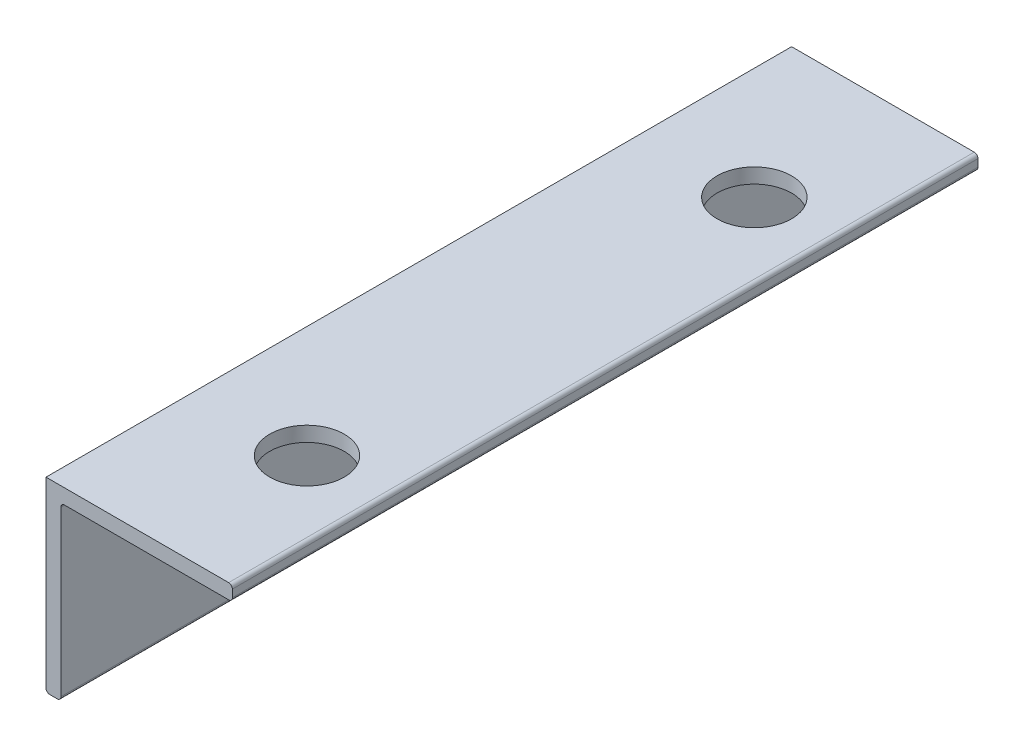
ISO-10303-21;
HEADER;
FILE_DESCRIPTION(('STEP AP214'),'2;1');
FILE_NAME('part.step','',(''),(''),'','','');
FILE_SCHEMA(('AUTOMOTIVE_DESIGN { 1 0 10303 214 1 1 1 1 }'));
ENDSEC;
DATA;
#1=APPLICATION_CONTEXT('core data for automotive mechanical design processes');
#2=APPLICATION_PROTOCOL_DEFINITION('international standard','automotive_design',2000,#1);
#3=PRODUCT_CONTEXT('',#1,'mechanical');
#4=PRODUCT('Part','Part','',(#3));
#5=PRODUCT_RELATED_PRODUCT_CATEGORY('part','',(#4));
#6=PRODUCT_DEFINITION_FORMATION('','',#4);
#7=PRODUCT_DEFINITION_CONTEXT('part definition',#1,'design');
#8=PRODUCT_DEFINITION('design','',#6,#7);
#9=PRODUCT_DEFINITION_SHAPE('','',#8);
#10=(LENGTH_UNIT() NAMED_UNIT(*) SI_UNIT(.MILLI.,.METRE.));
#11=(NAMED_UNIT(*) PLANE_ANGLE_UNIT() SI_UNIT($,.RADIAN.));
#12=(NAMED_UNIT(*) SI_UNIT($,.STERADIAN.) SOLID_ANGLE_UNIT());
#13=UNCERTAINTY_MEASURE_WITH_UNIT(LENGTH_MEASURE(1.E-05),#10,'distance_accuracy_value','');
#14=(GEOMETRIC_REPRESENTATION_CONTEXT(3) GLOBAL_UNCERTAINTY_ASSIGNED_CONTEXT((#13)) GLOBAL_UNIT_ASSIGNED_CONTEXT((#10,
#11,#12)) REPRESENTATION_CONTEXT('',''));
#15=CARTESIAN_POINT('',(0.,0.,0.));
#16=DIRECTION('',(0.,0.,1.));
#17=DIRECTION('',(1.,0.,0.));
#18=AXIS2_PLACEMENT_3D('',#15,#16,#17);
#19=CARTESIAN_POINT('',(-15.,15.,100.));
#20=DIRECTION('',(0.,-1.,0.));
#21=DIRECTION('',(0.,0.,-1.));
#22=AXIS2_PLACEMENT_3D('',#19,#20,#21);
#23=PLANE('',#22);
#24=CARTESIAN_POINT('',(0.,15.,20.));
#25=DIRECTION('',(0.,1.,0.));
#26=DIRECTION('',(0.,0.,1.));
#27=AXIS2_PLACEMENT_3D('',#24,#25,#26);
#28=CIRCLE('',#27,5.);
#29=CARTESIAN_POINT('',(0.,15.,25.));
#30=VERTEX_POINT('',#29);
#31=EDGE_CURVE('E250',#30,#30,#28,.T.);
#32=ORIENTED_EDGE('',*,*,#31,.F.);
#33=EDGE_LOOP('',(#32));
#34=FACE_BOUND('',#33,.T.);
#35=CARTESIAN_POINT('',(0.,15.,80.));
#36=DIRECTION('',(0.,1.,0.));
#37=DIRECTION('',(0.,0.,1.));
#38=AXIS2_PLACEMENT_3D('',#35,#36,#37);
#39=CIRCLE('',#38,5.);
#40=CARTESIAN_POINT('',(0.,15.,85.));
#41=VERTEX_POINT('',#40);
#42=EDGE_CURVE('E253',#41,#41,#39,.T.);
#43=ORIENTED_EDGE('',*,*,#42,.F.);
#44=EDGE_LOOP('',(#43));
#45=FACE_BOUND('',#44,.T.);
#46=DIRECTION('',(-1.,0.,0.));
#47=VECTOR('',#46,1.);
#48=CARTESIAN_POINT('',(-15.,15.,0.));
#49=LINE('',#48,#47);
#50=CARTESIAN_POINT('',(9.5,15.,0.));
#51=VERTEX_POINT('',#50);
#52=CARTESIAN_POINT('',(-15.,15.,0.));
#53=VERTEX_POINT('',#52);
#54=EDGE_CURVE('E149',#51,#53,#49,.T.);
#55=ORIENTED_EDGE('',*,*,#54,.T.);
#56=DIRECTION('',(0.,0.,-1.));
#57=VECTOR('',#56,1.);
#58=CARTESIAN_POINT('',(-15.,15.,100.));
#59=LINE('',#58,#57);
#60=CARTESIAN_POINT('',(-15.,15.,100.));
#61=VERTEX_POINT('',#60);
#62=EDGE_CURVE('E11',#61,#53,#59,.T.);
#63=ORIENTED_EDGE('',*,*,#62,.F.);
#64=DIRECTION('',(-1.,0.,0.));
#65=VECTOR('',#64,1.);
#66=CARTESIAN_POINT('',(-15.,15.,100.));
#67=LINE('',#66,#65);
#68=CARTESIAN_POINT('',(9.5,15.,100.));
#69=VERTEX_POINT('',#68);
#70=EDGE_CURVE('E170',#69,#61,#67,.T.);
#71=ORIENTED_EDGE('',*,*,#70,.F.);
#72=DIRECTION('',(0.,0.,-1.));
#73=VECTOR('',#72,1.);
#74=CARTESIAN_POINT('',(9.5,15.,100.));
#75=LINE('',#74,#73);
#76=EDGE_CURVE('E145',#69,#51,#75,.T.);
#77=ORIENTED_EDGE('',*,*,#76,.T.);
#78=EDGE_LOOP('',(#55,#63,#71,#77));
#79=FACE_BOUND('',#78,.T.);
#80=ADVANCED_FACE('F35',(#34,#45,#79),#23,.F.);
#81=CARTESIAN_POINT('',(-15.,-9.5,100.));
#82=DIRECTION('',(1.,0.,0.));
#83=DIRECTION('',(0.,0.,-1.));
#84=AXIS2_PLACEMENT_3D('',#81,#82,#83);
#85=PLANE('',#84);
#86=DIRECTION('',(0.,-1.,0.));
#87=VECTOR('',#86,1.);
#88=CARTESIAN_POINT('',(-15.,-9.5,0.));
#89=LINE('',#88,#87);
#90=CARTESIAN_POINT('',(-15.,-9.5,0.));
#91=VERTEX_POINT('',#90);
#92=EDGE_CURVE('E152',#53,#91,#89,.T.);
#93=ORIENTED_EDGE('',*,*,#92,.T.);
#94=DIRECTION('',(0.,0.,-1.));
#95=VECTOR('',#94,1.);
#96=CARTESIAN_POINT('',(-15.,-9.5,100.));
#97=LINE('',#96,#95);
#98=CARTESIAN_POINT('',(-15.,-9.5,100.));
#99=VERTEX_POINT('',#98);
#100=EDGE_CURVE('E43',#99,#91,#97,.T.);
#101=ORIENTED_EDGE('',*,*,#100,.F.);
#102=DIRECTION('',(0.,-1.,0.));
#103=VECTOR('',#102,1.);
#104=CARTESIAN_POINT('',(-15.,-9.5,100.));
#105=LINE('',#104,#103);
#106=EDGE_CURVE('E103',#61,#99,#105,.T.);
#107=ORIENTED_EDGE('',*,*,#106,.F.);
#108=ORIENTED_EDGE('',*,*,#62,.T.);
#109=EDGE_LOOP('',(#93,#101,#107,#108));
#110=FACE_BOUND('',#109,.T.);
#111=ADVANCED_FACE('F242',(#110),#85,.F.);
#112=CARTESIAN_POINT('',(-14.5,-9.5,100.));
#113=DIRECTION('',(0.,0.,-1.));
#114=DIRECTION('',(-1.,0.,0.));
#115=AXIS2_PLACEMENT_3D('',#112,#113,#114);
#116=CYLINDRICAL_SURFACE('',#115,0.5);
#117=CARTESIAN_POINT('',(-14.5,-9.5,0.));
#118=DIRECTION('',(0.,0.,1.));
#119=DIRECTION('',(-1.,0.,0.));
#120=AXIS2_PLACEMENT_3D('',#117,#118,#119);
#121=CIRCLE('',#120,0.5);
#122=CARTESIAN_POINT('',(-14.5,-10.,0.));
#123=VERTEX_POINT('',#122);
#124=EDGE_CURVE('E155',#91,#123,#121,.T.);
#125=ORIENTED_EDGE('',*,*,#124,.T.);
#126=DIRECTION('',(0.,0.,-1.));
#127=VECTOR('',#126,1.);
#128=CARTESIAN_POINT('',(-14.5,-10.,100.));
#129=LINE('',#128,#127);
#130=CARTESIAN_POINT('',(-14.5,-10.,100.));
#131=VERTEX_POINT('',#130);
#132=EDGE_CURVE('E186',#131,#123,#129,.T.);
#133=ORIENTED_EDGE('',*,*,#132,.F.);
#134=CARTESIAN_POINT('',(-14.5,-9.5,100.));
#135=DIRECTION('',(0.,0.,1.));
#136=DIRECTION('',(-1.,0.,0.));
#137=AXIS2_PLACEMENT_3D('',#134,#135,#136);
#138=CIRCLE('',#137,0.5);
#139=EDGE_CURVE('E194',#99,#131,#138,.T.);
#140=ORIENTED_EDGE('',*,*,#139,.F.);
#141=ORIENTED_EDGE('',*,*,#100,.T.);
#142=EDGE_LOOP('',(#125,#133,#140,#141));
#143=FACE_BOUND('',#142,.T.);
#144=ADVANCED_FACE('F192',(#143),#116,.T.);
#145=CARTESIAN_POINT('',(-14.5,-10.,100.));
#146=DIRECTION('',(0.,1.,0.));
#147=DIRECTION('',(0.,0.,1.));
#148=AXIS2_PLACEMENT_3D('',#145,#146,#147);
#149=PLANE('',#148);
#150=DIRECTION('',(1.,0.,0.));
#151=VECTOR('',#150,1.);
#152=CARTESIAN_POINT('',(-14.5,-10.,0.));
#153=LINE('',#152,#151);
#154=CARTESIAN_POINT('',(-13.5,-10.,0.));
#155=VERTEX_POINT('',#154);
#156=EDGE_CURVE('E157',#123,#155,#153,.T.);
#157=ORIENTED_EDGE('',*,*,#156,.T.);
#158=DIRECTION('',(0.,0.,-1.));
#159=VECTOR('',#158,1.);
#160=CARTESIAN_POINT('',(-13.5,-10.,100.));
#161=LINE('',#160,#159);
#162=CARTESIAN_POINT('',(-13.5,-10.,100.));
#163=VERTEX_POINT('',#162);
#164=EDGE_CURVE('E183',#163,#155,#161,.T.);
#165=ORIENTED_EDGE('',*,*,#164,.F.);
#166=DIRECTION('',(1.,0.,0.));
#167=VECTOR('',#166,1.);
#168=CARTESIAN_POINT('',(-14.5,-10.,100.));
#169=LINE('',#168,#167);
#170=EDGE_CURVE('E212',#131,#163,#169,.T.);
#171=ORIENTED_EDGE('',*,*,#170,.F.);
#172=ORIENTED_EDGE('',*,*,#132,.T.);
#173=EDGE_LOOP('',(#157,#165,#171,#172));
#174=FACE_BOUND('',#173,.T.);
#175=ADVANCED_FACE('F203',(#174),#149,.F.);
#176=CARTESIAN_POINT('',(-13.5,-9.5,100.));
#177=DIRECTION('',(0.,0.,-1.));
#178=DIRECTION('',(-1.,0.,0.));
#179=AXIS2_PLACEMENT_3D('',#176,#177,#178);
#180=CYLINDRICAL_SURFACE('',#179,0.500000000000002);
#181=CARTESIAN_POINT('',(-13.5,-9.5,0.));
#182=DIRECTION('',(0.,0.,1.));
#183=DIRECTION('',(1.,0.,0.));
#184=AXIS2_PLACEMENT_3D('',#181,#182,#183);
#185=CIRCLE('',#184,0.500000000000002);
#186=CARTESIAN_POINT('',(-13.,-9.5,0.));
#187=VERTEX_POINT('',#186);
#188=EDGE_CURVE('E159',#155,#187,#185,.T.);
#189=ORIENTED_EDGE('',*,*,#188,.T.);
#190=DIRECTION('',(0.,0.,-1.));
#191=VECTOR('',#190,1.);
#192=CARTESIAN_POINT('',(-13.,-9.5,100.));
#193=LINE('',#192,#191);
#194=CARTESIAN_POINT('',(-13.,-9.5,100.));
#195=VERTEX_POINT('',#194);
#196=EDGE_CURVE('E180',#195,#187,#193,.T.);
#197=ORIENTED_EDGE('',*,*,#196,.F.);
#198=CARTESIAN_POINT('',(-13.5,-9.5,100.));
#199=DIRECTION('',(0.,0.,1.));
#200=DIRECTION('',(1.,0.,0.));
#201=AXIS2_PLACEMENT_3D('',#198,#199,#200);
#202=CIRCLE('',#201,0.500000000000002);
#203=EDGE_CURVE('E209',#163,#195,#202,.T.);
#204=ORIENTED_EDGE('',*,*,#203,.F.);
#205=ORIENTED_EDGE('',*,*,#164,.T.);
#206=EDGE_LOOP('',(#189,#197,#204,#205));
#207=FACE_BOUND('',#206,.T.);
#208=ADVANCED_FACE('F207',(#207),#180,.T.);
#209=CARTESIAN_POINT('',(-13.,12.5,100.));
#210=DIRECTION('',(-1.,0.,0.));
#211=DIRECTION('',(0.,-1.,0.));
#212=AXIS2_PLACEMENT_3D('',#209,#210,#211);
#213=PLANE('',#212);
#214=DIRECTION('',(0.,1.,0.));
#215=VECTOR('',#214,1.);
#216=CARTESIAN_POINT('',(-13.,12.5,0.));
#217=LINE('',#216,#215);
#218=CARTESIAN_POINT('',(-13.,12.5,0.));
#219=VERTEX_POINT('',#218);
#220=EDGE_CURVE('E161',#187,#219,#217,.T.);
#221=ORIENTED_EDGE('',*,*,#220,.T.);
#222=DIRECTION('',(0.,0.,-1.));
#223=VECTOR('',#222,1.);
#224=CARTESIAN_POINT('',(-13.,12.5,100.));
#225=LINE('',#224,#223);
#226=CARTESIAN_POINT('',(-13.,12.5,100.));
#227=VERTEX_POINT('',#226);
#228=EDGE_CURVE('E177',#227,#219,#225,.T.);
#229=ORIENTED_EDGE('',*,*,#228,.F.);
#230=DIRECTION('',(0.,1.,0.));
#231=VECTOR('',#230,1.);
#232=CARTESIAN_POINT('',(-13.,12.5,100.));
#233=LINE('',#232,#231);
#234=EDGE_CURVE('E211',#195,#227,#233,.T.);
#235=ORIENTED_EDGE('',*,*,#234,.F.);
#236=ORIENTED_EDGE('',*,*,#196,.T.);
#237=EDGE_LOOP('',(#221,#229,#235,#236));
#238=FACE_BOUND('',#237,.T.);
#239=ADVANCED_FACE('F316',(#238),#213,.F.);
#240=CARTESIAN_POINT('',(-12.5,12.5,100.));
#241=DIRECTION('',(0.,0.,-1.));
#242=DIRECTION('',(-1.,0.,0.));
#243=AXIS2_PLACEMENT_3D('',#240,#241,#242);
#244=CYLINDRICAL_SURFACE('',#243,0.5);
#245=CARTESIAN_POINT('',(-12.5,12.5,0.));
#246=DIRECTION('',(0.,0.,-1.));
#247=DIRECTION('',(1.,0.,0.));
#248=AXIS2_PLACEMENT_3D('',#245,#246,#247);
#249=CIRCLE('',#248,0.5);
#250=CARTESIAN_POINT('',(-12.5,13.,0.));
#251=VERTEX_POINT('',#250);
#252=EDGE_CURVE('E163',#219,#251,#249,.T.);
#253=ORIENTED_EDGE('',*,*,#252,.T.);
#254=DIRECTION('',(0.,0.,-1.));
#255=VECTOR('',#254,1.);
#256=CARTESIAN_POINT('',(-12.5,13.,100.));
#257=LINE('',#256,#255);
#258=CARTESIAN_POINT('',(-12.5,13.,100.));
#259=VERTEX_POINT('',#258);
#260=EDGE_CURVE('E174',#259,#251,#257,.T.);
#261=ORIENTED_EDGE('',*,*,#260,.F.);
#262=CARTESIAN_POINT('',(-12.5,12.5,100.));
#263=DIRECTION('',(0.,0.,-1.));
#264=DIRECTION('',(1.,0.,0.));
#265=AXIS2_PLACEMENT_3D('',#262,#263,#264);
#266=CIRCLE('',#265,0.5);
#267=EDGE_CURVE('E214',#227,#259,#266,.T.);
#268=ORIENTED_EDGE('',*,*,#267,.F.);
#269=ORIENTED_EDGE('',*,*,#228,.T.);
#270=EDGE_LOOP('',(#253,#261,#268,#269));
#271=FACE_BOUND('',#270,.T.);
#272=ADVANCED_FACE('F223',(#271),#244,.F.);
#273=CARTESIAN_POINT('',(9.5,13.,100.));
#274=DIRECTION('',(0.,1.,0.));
#275=DIRECTION('',(-1.,0.,0.));
#276=AXIS2_PLACEMENT_3D('',#273,#274,#275);
#277=PLANE('',#276);
#278=CARTESIAN_POINT('',(0.,13.,20.));
#279=DIRECTION('',(0.,1.,0.));
#280=DIRECTION('',(-1.,0.,0.));
#281=AXIS2_PLACEMENT_3D('',#278,#279,#280);
#282=CIRCLE('',#281,5.);
#283=CARTESIAN_POINT('',(-5.,13.,20.));
#284=VERTEX_POINT('',#283);
#285=EDGE_CURVE('E255',#284,#284,#282,.F.);
#286=ORIENTED_EDGE('',*,*,#285,.F.);
#287=EDGE_LOOP('',(#286));
#288=FACE_BOUND('',#287,.T.);
#289=CARTESIAN_POINT('',(0.,13.,80.));
#290=DIRECTION('',(0.,1.,0.));
#291=DIRECTION('',(-1.,0.,0.));
#292=AXIS2_PLACEMENT_3D('',#289,#290,#291);
#293=CIRCLE('',#292,5.);
#294=CARTESIAN_POINT('',(-5.,13.,80.));
#295=VERTEX_POINT('',#294);
#296=EDGE_CURVE('E153',#295,#295,#293,.F.);
#297=ORIENTED_EDGE('',*,*,#296,.F.);
#298=EDGE_LOOP('',(#297));
#299=FACE_BOUND('',#298,.T.);
#300=DIRECTION('',(1.,0.,0.));
#301=VECTOR('',#300,1.);
#302=CARTESIAN_POINT('',(9.5,13.,0.));
#303=LINE('',#302,#301);
#304=CARTESIAN_POINT('',(9.5,13.,0.));
#305=VERTEX_POINT('',#304);
#306=EDGE_CURVE('E165',#251,#305,#303,.T.);
#307=ORIENTED_EDGE('',*,*,#306,.T.);
#308=DIRECTION('',(0.,0.,-1.));
#309=VECTOR('',#308,1.);
#310=CARTESIAN_POINT('',(9.5,13.,100.));
#311=LINE('',#310,#309);
#312=CARTESIAN_POINT('',(9.5,13.,100.));
#313=VERTEX_POINT('',#312);
#314=EDGE_CURVE('E140',#313,#305,#311,.T.);
#315=ORIENTED_EDGE('',*,*,#314,.F.);
#316=DIRECTION('',(1.,0.,0.));
#317=VECTOR('',#316,1.);
#318=CARTESIAN_POINT('',(9.5,13.,100.));
#319=LINE('',#318,#317);
#320=EDGE_CURVE('E131',#259,#313,#319,.T.);
#321=ORIENTED_EDGE('',*,*,#320,.F.);
#322=ORIENTED_EDGE('',*,*,#260,.T.);
#323=EDGE_LOOP('',(#307,#315,#321,#322));
#324=FACE_BOUND('',#323,.T.);
#325=ADVANCED_FACE('F227',(#288,#299,#324),#277,.F.);
#326=CARTESIAN_POINT('',(9.5,13.5,100.));
#327=DIRECTION('',(0.,0.,-1.));
#328=DIRECTION('',(-1.,0.,0.));
#329=AXIS2_PLACEMENT_3D('',#326,#327,#328);
#330=CYLINDRICAL_SURFACE('',#329,0.5);
#331=CARTESIAN_POINT('',(9.5,13.5,0.));
#332=DIRECTION('',(0.,0.,1.));
#333=DIRECTION('',(-1.,0.,0.));
#334=AXIS2_PLACEMENT_3D('',#331,#332,#333);
#335=CIRCLE('',#334,0.5);
#336=CARTESIAN_POINT('',(10.,13.5,0.));
#337=VERTEX_POINT('',#336);
#338=EDGE_CURVE('E139',#305,#337,#335,.T.);
#339=ORIENTED_EDGE('',*,*,#338,.T.);
#340=DIRECTION('',(0.,0.,-1.));
#341=VECTOR('',#340,1.);
#342=CARTESIAN_POINT('',(10.,13.5,100.));
#343=LINE('',#342,#341);
#344=CARTESIAN_POINT('',(10.,13.5,100.));
#345=VERTEX_POINT('',#344);
#346=EDGE_CURVE('E136',#345,#337,#343,.T.);
#347=ORIENTED_EDGE('',*,*,#346,.F.);
#348=CARTESIAN_POINT('',(9.5,13.5,100.));
#349=DIRECTION('',(0.,0.,1.));
#350=DIRECTION('',(-1.,0.,0.));
#351=AXIS2_PLACEMENT_3D('',#348,#349,#350);
#352=CIRCLE('',#351,0.5);
#353=EDGE_CURVE('E125',#313,#345,#352,.T.);
#354=ORIENTED_EDGE('',*,*,#353,.F.);
#355=ORIENTED_EDGE('',*,*,#314,.T.);
#356=EDGE_LOOP('',(#339,#347,#354,#355));
#357=FACE_BOUND('',#356,.T.);
#358=ADVANCED_FACE('F137',(#357),#330,.T.);
#359=CARTESIAN_POINT('',(10.,14.5,100.));
#360=DIRECTION('',(-1.,0.,0.));
#361=DIRECTION('',(0.,0.,1.));
#362=AXIS2_PLACEMENT_3D('',#359,#360,#361);
#363=PLANE('',#362);
#364=DIRECTION('',(0.,1.,0.));
#365=VECTOR('',#364,1.);
#366=CARTESIAN_POINT('',(10.,14.5,0.));
#367=LINE('',#366,#365);
#368=CARTESIAN_POINT('',(10.,14.5,0.));
#369=VERTEX_POINT('',#368);
#370=EDGE_CURVE('E89',#337,#369,#367,.T.);
#371=ORIENTED_EDGE('',*,*,#370,.T.);
#372=DIRECTION('',(0.,0.,-1.));
#373=VECTOR('',#372,1.);
#374=CARTESIAN_POINT('',(10.,14.5,100.));
#375=LINE('',#374,#373);
#376=CARTESIAN_POINT('',(10.,14.5,100.));
#377=VERTEX_POINT('',#376);
#378=EDGE_CURVE('E141',#377,#369,#375,.T.);
#379=ORIENTED_EDGE('',*,*,#378,.F.);
#380=DIRECTION('',(0.,1.,0.));
#381=VECTOR('',#380,1.);
#382=CARTESIAN_POINT('',(10.,14.5,100.));
#383=LINE('',#382,#381);
#384=EDGE_CURVE('E129',#345,#377,#383,.T.);
#385=ORIENTED_EDGE('',*,*,#384,.F.);
#386=ORIENTED_EDGE('',*,*,#346,.T.);
#387=EDGE_LOOP('',(#371,#379,#385,#386));
#388=FACE_BOUND('',#387,.T.);
#389=ADVANCED_FACE('F143',(#388),#363,.F.);
#390=CARTESIAN_POINT('',(9.5,14.5,100.));
#391=DIRECTION('',(0.,0.,-1.));
#392=DIRECTION('',(-1.,0.,0.));
#393=AXIS2_PLACEMENT_3D('',#390,#391,#392);
#394=CYLINDRICAL_SURFACE('',#393,0.5);
#395=CARTESIAN_POINT('',(9.5,14.5,0.));
#396=DIRECTION('',(0.,0.,1.));
#397=DIRECTION('',(-1.,0.,0.));
#398=AXIS2_PLACEMENT_3D('',#395,#396,#397);
#399=CIRCLE('',#398,0.5);
#400=EDGE_CURVE('E95',#369,#51,#399,.T.);
#401=ORIENTED_EDGE('',*,*,#400,.T.);
#402=ORIENTED_EDGE('',*,*,#76,.F.);
#403=CARTESIAN_POINT('',(9.5,14.5,100.));
#404=DIRECTION('',(0.,0.,1.));
#405=DIRECTION('',(-1.,0.,0.));
#406=AXIS2_PLACEMENT_3D('',#403,#404,#405);
#407=CIRCLE('',#406,0.5);
#408=EDGE_CURVE('E51',#377,#69,#407,.T.);
#409=ORIENTED_EDGE('',*,*,#408,.F.);
#410=ORIENTED_EDGE('',*,*,#378,.T.);
#411=EDGE_LOOP('',(#401,#402,#409,#410));
#412=FACE_BOUND('',#411,.T.);
#413=ADVANCED_FACE('F231',(#412),#394,.T.);
#414=CARTESIAN_POINT('',(9.5,14.5,100.));
#415=DIRECTION('',(0.,0.,-1.));
#416=DIRECTION('',(-1.,0.,0.));
#417=AXIS2_PLACEMENT_3D('',#414,#415,#416);
#418=PLANE('',#417);
#419=ORIENTED_EDGE('',*,*,#70,.T.);
#420=ORIENTED_EDGE('',*,*,#106,.T.);
#421=ORIENTED_EDGE('',*,*,#139,.T.);
#422=ORIENTED_EDGE('',*,*,#170,.T.);
#423=ORIENTED_EDGE('',*,*,#203,.T.);
#424=ORIENTED_EDGE('',*,*,#234,.T.);
#425=ORIENTED_EDGE('',*,*,#267,.T.);
#426=ORIENTED_EDGE('',*,*,#320,.T.);
#427=ORIENTED_EDGE('',*,*,#353,.T.);
#428=ORIENTED_EDGE('',*,*,#384,.T.);
#429=ORIENTED_EDGE('',*,*,#408,.T.);
#430=EDGE_LOOP('',(#419,#420,#421,#422,#423,#424,#425,#426,#427,#428,#429));
#431=FACE_BOUND('',#430,.T.);
#432=ADVANCED_FACE('F127',(#431),#418,.F.);
#433=CARTESIAN_POINT('',(9.5,14.5,0.));
#434=DIRECTION('',(0.,0.,-1.));
#435=DIRECTION('',(-1.,0.,0.));
#436=AXIS2_PLACEMENT_3D('',#433,#434,#435);
#437=PLANE('',#436);
#438=ORIENTED_EDGE('',*,*,#54,.F.);
#439=ORIENTED_EDGE('',*,*,#400,.F.);
#440=ORIENTED_EDGE('',*,*,#370,.F.);
#441=ORIENTED_EDGE('',*,*,#338,.F.);
#442=ORIENTED_EDGE('',*,*,#306,.F.);
#443=ORIENTED_EDGE('',*,*,#252,.F.);
#444=ORIENTED_EDGE('',*,*,#220,.F.);
#445=ORIENTED_EDGE('',*,*,#188,.F.);
#446=ORIENTED_EDGE('',*,*,#156,.F.);
#447=ORIENTED_EDGE('',*,*,#124,.F.);
#448=ORIENTED_EDGE('',*,*,#92,.F.);
#449=EDGE_LOOP('',(#438,#439,#440,#441,#442,#443,#444,#445,#446,#447,#448));
#450=FACE_BOUND('',#449,.T.);
#451=ADVANCED_FACE('F198',(#450),#437,.T.);
#452=CARTESIAN_POINT('',(0.,-10.001,80.));
#453=DIRECTION('',(0.,1.,0.));
#454=DIRECTION('',(0.,0.,1.));
#455=AXIS2_PLACEMENT_3D('',#452,#453,#454);
#456=CYLINDRICAL_SURFACE('',#455,5.);
#457=ORIENTED_EDGE('',*,*,#42,.T.);
#458=EDGE_LOOP('',(#457));
#459=FACE_BOUND('',#458,.T.);
#460=ORIENTED_EDGE('',*,*,#296,.T.);
#461=EDGE_LOOP('',(#460));
#462=FACE_BOUND('',#461,.T.);
#463=ADVANCED_FACE('F268',(#459,#462),#456,.F.);
#464=CARTESIAN_POINT('',(0.,-10.001,20.));
#465=DIRECTION('',(0.,1.,0.));
#466=DIRECTION('',(0.,0.,1.));
#467=AXIS2_PLACEMENT_3D('',#464,#465,#466);
#468=CYLINDRICAL_SURFACE('',#467,5.);
#469=ORIENTED_EDGE('',*,*,#31,.T.);
#470=EDGE_LOOP('',(#469));
#471=FACE_BOUND('',#470,.T.);
#472=ORIENTED_EDGE('',*,*,#285,.T.);
#473=EDGE_LOOP('',(#472));
#474=FACE_BOUND('',#473,.T.);
#475=ADVANCED_FACE('F265',(#471,#474),#468,.F.);
#476=CLOSED_SHELL('',(#80,#111,#144,#175,#208,#239,#272,#325,#358,#389,#413,#432,#451,#463,#475));
#477=MANIFOLD_SOLID_BREP('B2',#476);
#478=ADVANCED_BREP_SHAPE_REPRESENTATION('',(#18,#477),#14);
#479=SHAPE_DEFINITION_REPRESENTATION(#9,#478);
ENDSEC;
END-ISO-10303-21;
